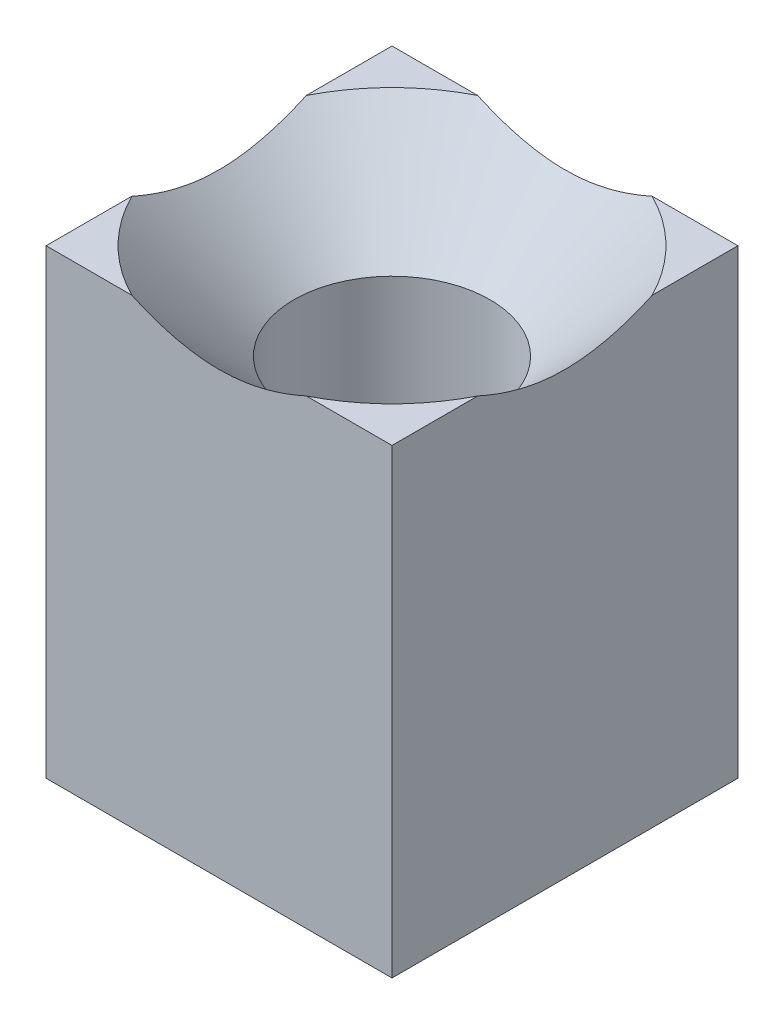
ISO-10303-21;
HEADER;
FILE_DESCRIPTION(('STEP AP214'),'2;1');
FILE_NAME('part.step','',(''),(''),'','','');
FILE_SCHEMA(('AUTOMOTIVE_DESIGN { 1 0 10303 214 1 1 1 1 }'));
ENDSEC;
DATA;
#1=APPLICATION_CONTEXT('core data for automotive mechanical design processes');
#2=APPLICATION_PROTOCOL_DEFINITION('international standard','automotive_design',2000,#1);
#3=PRODUCT_CONTEXT('',#1,'mechanical');
#4=PRODUCT('Part','Part','',(#3));
#5=PRODUCT_RELATED_PRODUCT_CATEGORY('part','',(#4));
#6=PRODUCT_DEFINITION_FORMATION('','',#4);
#7=PRODUCT_DEFINITION_CONTEXT('part definition',#1,'design');
#8=PRODUCT_DEFINITION('design','',#6,#7);
#9=PRODUCT_DEFINITION_SHAPE('','',#8);
#10=(LENGTH_UNIT() NAMED_UNIT(*) SI_UNIT(.MILLI.,.METRE.));
#11=(NAMED_UNIT(*) PLANE_ANGLE_UNIT() SI_UNIT($,.RADIAN.));
#12=(NAMED_UNIT(*) SI_UNIT($,.STERADIAN.) SOLID_ANGLE_UNIT());
#13=UNCERTAINTY_MEASURE_WITH_UNIT(LENGTH_MEASURE(1.E-05),#10,'distance_accuracy_value','');
#14=(GEOMETRIC_REPRESENTATION_CONTEXT(3) GLOBAL_UNCERTAINTY_ASSIGNED_CONTEXT((#13)) GLOBAL_UNIT_ASSIGNED_CONTEXT((#10,
#11,#12)) REPRESENTATION_CONTEXT('',''));
#15=CARTESIAN_POINT('',(0.,0.,0.));
#16=DIRECTION('',(0.,0.,1.));
#17=DIRECTION('',(1.,0.,0.));
#18=AXIS2_PLACEMENT_3D('',#15,#16,#17);
#19=CARTESIAN_POINT('',(0.,8.,0.));
#20=DIRECTION('',(0.,1.,0.));
#21=DIRECTION('',(0.,0.,1.));
#22=AXIS2_PLACEMENT_3D('',#19,#20,#21);
#23=PLANE('',#22);
#24=CARTESIAN_POINT('',(0.,8.,0.));
#25=DIRECTION('',(0.,1.,0.));
#26=DIRECTION('',(0.,0.,1.));
#27=AXIS2_PLACEMENT_3D('',#24,#25,#26);
#28=CIRCLE('',#27,3.36);
#29=CARTESIAN_POINT('',(1.51314242555022,8.,3.));
#30=VERTEX_POINT('',#29);
#31=CARTESIAN_POINT('',(3.,8.,1.51314242555022));
#32=VERTEX_POINT('',#31);
#33=EDGE_CURVE('E115',#30,#32,#28,.T.);
#34=ORIENTED_EDGE('',*,*,#33,.F.);
#35=DIRECTION('',(1.,0.,0.));
#36=VECTOR('',#35,1.);
#37=CARTESIAN_POINT('',(3.,8.,3.));
#38=LINE('',#37,#36);
#39=CARTESIAN_POINT('',(3.,8.,3.));
#40=VERTEX_POINT('',#39);
#41=EDGE_CURVE('E125',#30,#40,#38,.T.);
#42=ORIENTED_EDGE('',*,*,#41,.T.);
#43=DIRECTION('',(0.,0.,-1.));
#44=VECTOR('',#43,1.);
#45=CARTESIAN_POINT('',(3.,8.,3.));
#46=LINE('',#45,#44);
#47=EDGE_CURVE('E128',#40,#32,#46,.T.);
#48=ORIENTED_EDGE('',*,*,#47,.T.);
#49=EDGE_LOOP('',(#34,#42,#48));
#50=FACE_BOUND('',#49,.T.);
#51=ADVANCED_FACE('F35',(#50),#23,.T.);
#52=CARTESIAN_POINT('',(3.,8.,-1.51314242555022));
#53=VERTEX_POINT('',#52);
#54=CARTESIAN_POINT('',(1.51314242555022,8.,-3.));
#55=VERTEX_POINT('',#54);
#56=EDGE_CURVE('E52',#53,#55,#28,.T.);
#57=ORIENTED_EDGE('',*,*,#56,.F.);
#58=CARTESIAN_POINT('',(3.,8.,-3.));
#59=VERTEX_POINT('',#58);
#60=EDGE_CURVE('E136',#53,#59,#46,.T.);
#61=ORIENTED_EDGE('',*,*,#60,.T.);
#62=DIRECTION('',(-1.,0.,0.));
#63=VECTOR('',#62,1.);
#64=CARTESIAN_POINT('',(3.,8.,-3.));
#65=LINE('',#64,#63);
#66=EDGE_CURVE('E141',#59,#55,#65,.T.);
#67=ORIENTED_EDGE('',*,*,#66,.T.);
#68=EDGE_LOOP('',(#57,#61,#67));
#69=FACE_BOUND('',#68,.T.);
#70=ADVANCED_FACE('F205',(#69),#23,.T.);
#71=CARTESIAN_POINT('',(-1.51314242555022,8.,-3.));
#72=VERTEX_POINT('',#71);
#73=CARTESIAN_POINT('',(-3.,8.,-1.51314242555022));
#74=VERTEX_POINT('',#73);
#75=EDGE_CURVE('E218',#72,#74,#28,.T.);
#76=ORIENTED_EDGE('',*,*,#75,.F.);
#77=CARTESIAN_POINT('',(-3.,8.,-3.));
#78=VERTEX_POINT('',#77);
#79=EDGE_CURVE('E60',#72,#78,#65,.T.);
#80=ORIENTED_EDGE('',*,*,#79,.T.);
#81=DIRECTION('',(0.,0.,1.));
#82=VECTOR('',#81,1.);
#83=CARTESIAN_POINT('',(-3.,8.,3.));
#84=LINE('',#83,#82);
#85=EDGE_CURVE('E134',#78,#74,#84,.T.);
#86=ORIENTED_EDGE('',*,*,#85,.T.);
#87=EDGE_LOOP('',(#76,#80,#86));
#88=FACE_BOUND('',#87,.T.);
#89=ADVANCED_FACE('F210',(#88),#23,.T.);
#90=CARTESIAN_POINT('',(-3.,8.,1.51314242555022));
#91=VERTEX_POINT('',#90);
#92=CARTESIAN_POINT('',(-1.51314242555022,8.,3.));
#93=VERTEX_POINT('',#92);
#94=EDGE_CURVE('E117',#91,#93,#28,.T.);
#95=ORIENTED_EDGE('',*,*,#94,.F.);
#96=CARTESIAN_POINT('',(-3.,8.,3.));
#97=VERTEX_POINT('',#96);
#98=EDGE_CURVE('E90',#91,#97,#84,.T.);
#99=ORIENTED_EDGE('',*,*,#98,.T.);
#100=EDGE_CURVE('E133',#97,#93,#38,.T.);
#101=ORIENTED_EDGE('',*,*,#100,.T.);
#102=EDGE_LOOP('',(#95,#99,#101));
#103=FACE_BOUND('',#102,.T.);
#104=ADVANCED_FACE('F206',(#103),#23,.T.);
#105=CARTESIAN_POINT('',(0.,0.,0.));
#106=DIRECTION('',(0.,1.,0.));
#107=DIRECTION('',(0.,0.,1.));
#108=AXIS2_PLACEMENT_3D('',#105,#106,#107);
#109=PLANE('',#108);
#110=CARTESIAN_POINT('',(0.,0.,0.));
#111=DIRECTION('',(0.,1.,0.));
#112=DIRECTION('',(0.,0.,1.));
#113=AXIS2_PLACEMENT_3D('',#110,#111,#112);
#114=CIRCLE('',#113,1.7);
#115=CARTESIAN_POINT('',(0.,0.,1.7));
#116=VERTEX_POINT('',#115);
#117=EDGE_CURVE('E40',#116,#116,#114,.T.);
#118=ORIENTED_EDGE('',*,*,#117,.T.);
#119=EDGE_LOOP('',(#118));
#120=FACE_BOUND('',#119,.T.);
#121=DIRECTION('',(0.,0.,1.));
#122=VECTOR('',#121,1.);
#123=CARTESIAN_POINT('',(-3.,0.,3.));
#124=LINE('',#123,#122);
#125=CARTESIAN_POINT('',(-3.,0.,-3.));
#126=VERTEX_POINT('',#125);
#127=CARTESIAN_POINT('',(-3.,0.,3.));
#128=VERTEX_POINT('',#127);
#129=EDGE_CURVE('E145',#126,#128,#124,.T.);
#130=ORIENTED_EDGE('',*,*,#129,.F.);
#131=DIRECTION('',(-1.,0.,0.));
#132=VECTOR('',#131,1.);
#133=CARTESIAN_POINT('',(3.,0.,-3.));
#134=LINE('',#133,#132);
#135=CARTESIAN_POINT('',(3.,0.,-3.));
#136=VERTEX_POINT('',#135);
#137=EDGE_CURVE('E82',#136,#126,#134,.T.);
#138=ORIENTED_EDGE('',*,*,#137,.F.);
#139=DIRECTION('',(0.,0.,-1.));
#140=VECTOR('',#139,1.);
#141=CARTESIAN_POINT('',(3.,0.,3.));
#142=LINE('',#141,#140);
#143=CARTESIAN_POINT('',(3.,0.,3.));
#144=VERTEX_POINT('',#143);
#145=EDGE_CURVE('E150',#144,#136,#142,.T.);
#146=ORIENTED_EDGE('',*,*,#145,.F.);
#147=DIRECTION('',(1.,0.,0.));
#148=VECTOR('',#147,1.);
#149=CARTESIAN_POINT('',(3.,0.,3.));
#150=LINE('',#149,#148);
#151=EDGE_CURVE('E148',#128,#144,#150,.T.);
#152=ORIENTED_EDGE('',*,*,#151,.F.);
#153=EDGE_LOOP('',(#130,#138,#146,#152));
#154=FACE_BOUND('',#153,.T.);
#155=ADVANCED_FACE('F202',(#120,#154),#109,.F.);
#156=CARTESIAN_POINT('',(-3.,8.,3.));
#157=DIRECTION('',(1.,0.,0.));
#158=DIRECTION('',(0.,0.,-1.));
#159=AXIS2_PLACEMENT_3D('',#156,#157,#158);
#160=PLANE('',#159);
#161=ORIENTED_EDGE('',*,*,#98,.F.);
#162=CARTESIAN_POINT('',(-3.,10.685717905521,-5.2488765458084));
#163=CARTESIAN_POINT('',(-3.,10.5761926870492,-5.12269941055242));
#164=CARTESIAN_POINT('',(-3.,10.4671958831031,-4.99605810231777));
#165=CARTESIAN_POINT('',(-3.,10.2505455199257,-4.74159707934349));
#166=CARTESIAN_POINT('',(-3.,10.1428921817638,-4.61377717652789));
#167=CARTESIAN_POINT('',(-3.,9.92850442866118,-4.35585162740521));
#168=CARTESIAN_POINT('',(-3.,9.82178169333089,-4.22573624978875));
#169=CARTESIAN_POINT('',(-3.,9.61047693063371,-3.96379091417701));
#170=CARTESIAN_POINT('',(-3.,9.50589474485612,-3.83196108424869));
#171=CARTESIAN_POINT('',(-3.,9.29089788868376,-3.55514879722237));
#172=CARTESIAN_POINT('',(-3.,9.18071904390069,-3.40998243523561));
#173=CARTESIAN_POINT('',(-3.,8.96461814632388,-3.1164410496452));
#174=CARTESIAN_POINT('',(-3.,8.85869713058463,-2.96806525771325));
#175=CARTESIAN_POINT('',(-3.,8.65306120433006,-2.66769958051829));
#176=CARTESIAN_POINT('',(-3.,8.55332866269904,-2.51572184550591));
#177=CARTESIAN_POINT('',(-3.,8.36217506680553,-2.20666284849887));
#178=CARTESIAN_POINT('',(-3.,8.27074899295309,-2.04958474761364));
#179=CARTESIAN_POINT('',(-3.,8.12872366147334,-1.78304138774352));
#180=CARTESIAN_POINT('',(-3.,8.07475340827989,-1.67538233294628));
#181=CARTESIAN_POINT('',(-3.,7.97361507227203,-1.45683923147125));
#182=CARTESIAN_POINT('',(-3.,7.92644875001231,-1.34595435898262));
#183=CARTESIAN_POINT('',(-3.,7.84141756766864,-1.12232672773142));
#184=CARTESIAN_POINT('',(-3.,7.80343656746545,-1.00962875693416));
#185=CARTESIAN_POINT('',(-3.,7.73811182404611,-0.781177848295501));
#186=CARTESIAN_POINT('',(-3.,7.71076242220193,-0.665426570695889));
#187=CARTESIAN_POINT('',(-3.,7.67380968662833,-0.45999475059348));
#188=CARTESIAN_POINT('',(-3.,7.66151125717146,-0.370798886117144));
#189=CARTESIAN_POINT('',(-3.,7.64479563284063,-0.191673101057394));
#190=CARTESIAN_POINT('',(-3.,7.64037688385227,-0.101743328738836));
#191=CARTESIAN_POINT('',(-3.,7.63966956796859,0.0781334670692069));
#192=CARTESIAN_POINT('',(-3.,7.64337963266014,0.168080485106732));
#193=CARTESIAN_POINT('',(-3.,7.65871443695603,0.347299944117987));
#194=CARTESIAN_POINT('',(-3.,7.67034073599648,0.436572248674365));
#195=CARTESIAN_POINT('',(-3.,7.70529502594965,0.639251752591134));
#196=CARTESIAN_POINT('',(-3.,7.73102139392333,0.752245095939798));
#197=CARTESIAN_POINT('',(-3.,7.79274900887921,0.975374327850341));
#198=CARTESIAN_POINT('',(-3.,7.8287550187114,1.08550886598202));
#199=CARTESIAN_POINT('',(-3.,7.90963001948522,1.30420649872426));
#200=CARTESIAN_POINT('',(-3.,7.95461742986205,1.41272517591908));
#201=CARTESIAN_POINT('',(-3.,8.05129264945445,1.62666068199334));
#202=CARTESIAN_POINT('',(-3.,8.10297856522043,1.73207837712671));
#203=CARTESIAN_POINT('',(-3.,8.20683301131955,1.9310229843335));
#204=CARTESIAN_POINT('',(-3.,8.2585615144255,2.02478180210751));
#205=CARTESIAN_POINT('',(-3.,8.36553439142128,2.21027955174288));
#206=CARTESIAN_POINT('',(-3.,8.4207793150772,2.3020181647277));
#207=CARTESIAN_POINT('',(-3.,8.59081127146672,2.57472825624921));
#208=CARTESIAN_POINT('',(-3.,8.70982366582286,2.75306114666383));
#209=CARTESIAN_POINT('',(-3.,8.95581824422235,3.10518004453106));
#210=CARTESIAN_POINT('',(-3.,9.08283205357709,3.27894359073622));
#211=CARTESIAN_POINT('',(-3.,9.34205295904158,3.62242742572967));
#212=CARTESIAN_POINT('',(-3.,9.47425798905952,3.79214928074918));
#213=CARTESIAN_POINT('',(-3.,9.72975965044763,4.11267355044361));
#214=CARTESIAN_POINT('',(-3.,9.85271710849406,4.26374787195858));
#215=CARTESIAN_POINT('',(-3.,10.1010067353303,4.56395741857012));
#216=CARTESIAN_POINT('',(-3.,10.2263391706353,4.71309242283586));
#217=CARTESIAN_POINT('',(-3.,10.4776642164854,5.00842256345542));
#218=CARTESIAN_POINT('',(-3.,10.6036399036846,5.15463213871626));
#219=CARTESIAN_POINT('',(-3.,10.8570150287552,5.44576194068198));
#220=CARTESIAN_POINT('',(-3.,10.9844141766185,5.59068241959095));
#221=CARTESIAN_POINT('',(-3.,11.1123632181624,5.73510990547016));
#222=B_SPLINE_CURVE_WITH_KNOTS('',3,(#162,#163,#164,#165,#166,#167,#168,#169,#170,#171,#172,
#173,#174,#175,#176,#177,#178,#179,#180,#181,#182,#183,#184,#185,#186,#187,#188,#189,#190,#191,
#192,#193,#194,#195,#196,#197,#198,#199,#200,#201,#202,#203,#204,#205,#206,#207,#208,#209,#210,
#211,#212,#213,#214,#215,#216,#217,#218,#219,#220,#221),.UNSPECIFIED.,.F.,.F.,(4,2,2,2,2,2,2,2,
2,2,2,2,2,2,2,2,2,2,2,2,2,2,2,2,2,2,2,2,2,4),(0.,0.501251133193811,1.00258368840899,
1.50741981032327,2.0122184359198,2.55889147945074,3.10569687598749,3.65086518461985,
4.19570182636092,4.55681141376252,4.91801427329926,5.27437837568711,5.63055254407822,
5.9003552736087,6.17010478388626,6.43980888773347,6.7095661365521,7.05661714078059,
7.40382920528015,7.75596394775607,8.10799936941069,8.42915499675328,8.75036095829726,
9.39322501280749,10.0388123137442,10.6841452264875,11.2684784073307,11.8528775538182,
12.4318527931201,13.0107121514098),.UNSPECIFIED.);
#223=EDGE_CURVE('E120',#91,#74,#222,.F.);
#224=ORIENTED_EDGE('',*,*,#223,.T.);
#225=ORIENTED_EDGE('',*,*,#85,.F.);
#226=DIRECTION('',(0.,-1.,0.));
#227=VECTOR('',#226,1.);
#228=CARTESIAN_POINT('',(-3.,8.,-3.));
#229=LINE('',#228,#227);
#230=EDGE_CURVE('E144',#78,#126,#229,.T.);
#231=ORIENTED_EDGE('',*,*,#230,.T.);
#232=ORIENTED_EDGE('',*,*,#129,.T.);
#233=DIRECTION('',(0.,-1.,0.));
#234=VECTOR('',#233,1.);
#235=CARTESIAN_POINT('',(-3.,8.,3.));
#236=LINE('',#235,#234);
#237=EDGE_CURVE('E45',#97,#128,#236,.T.);
#238=ORIENTED_EDGE('',*,*,#237,.F.);
#239=EDGE_LOOP('',(#161,#224,#225,#231,#232,#238));
#240=FACE_BOUND('',#239,.T.);
#241=ADVANCED_FACE('F37',(#240),#160,.F.);
#242=CARTESIAN_POINT('',(3.,8.,3.));
#243=DIRECTION('',(0.,0.,-1.));
#244=DIRECTION('',(-1.,0.,0.));
#245=AXIS2_PLACEMENT_3D('',#242,#243,#244);
#246=PLANE('',#245);
#247=ORIENTED_EDGE('',*,*,#41,.F.);
#248=CARTESIAN_POINT('',(-5.24887715652433,10.685718435743,3.));
#249=CARTESIAN_POINT('',(-5.12270000145323,10.5761931969342,3.));
#250=CARTESIAN_POINT('',(-4.99605867338169,10.4671963726608,3.));
#251=CARTESIAN_POINT('',(-4.74159761064497,10.2505459688796,3.));
#252=CARTESIAN_POINT('',(-4.61377768790381,10.1428926104412,3.));
#253=CARTESIAN_POINT('',(-4.35585209848053,9.92850481658087,3.));
#254=CARTESIAN_POINT('',(-4.22573670048613,9.82178206077249,3.));
#255=CARTESIAN_POINT('',(-3.96379132392594,9.61047725728873,3.));
#256=CARTESIAN_POINT('',(-3.83196147342716,9.50589505120259,3.));
#257=CARTESIAN_POINT('',(-3.55514914045877,9.29089815084935,3.));
#258=CARTESIAN_POINT('',(-3.4099827530264,9.18071928227949,3.));
#259=CARTESIAN_POINT('',(-3.11644131583787,8.96461833785804,3.));
#260=CARTESIAN_POINT('',(-2.96806549775293,8.85869729906155,3.));
#261=CARTESIAN_POINT('',(-2.66769976739014,8.65306132813249,3.));
#262=CARTESIAN_POINT('',(-2.51572200536918,8.55332876487586,3.));
#263=CARTESIAN_POINT('',(-2.20666295278159,8.36217512799698,3.));
#264=CARTESIAN_POINT('',(-2.04958482332657,8.27074903478155,3.));
#265=CARTESIAN_POINT('',(-1.78304143064867,8.12872368335441,3.));
#266=CARTESIAN_POINT('',(-1.67538237270064,8.0747534276047,3.));
#267=CARTESIAN_POINT('',(-1.45683926473668,7.97361508673884,3.));
#268=CARTESIAN_POINT('',(-1.34595438890972,7.92644876217778,3.));
#269=CARTESIAN_POINT('',(-1.12232675096026,7.84141757572608,3.));
#270=CARTESIAN_POINT('',(-1.00962877681051,7.80343657369909,3.));
#271=CARTESIAN_POINT('',(-0.781177861252196,7.73811182720275,3.));
#272=CARTESIAN_POINT('',(-0.665426580085742,7.71076242410435,3.));
#273=CARTESIAN_POINT('',(-0.459994756534912,7.67380968753528,3.));
#274=CARTESIAN_POINT('',(-0.370798892254225,7.66151125793057,3.));
#275=CARTESIAN_POINT('',(-0.191673107573671,7.64479563326254,3.));
#276=CARTESIAN_POINT('',(-0.10174333543867,7.64037688408472,3.));
#277=CARTESIAN_POINT('',(0.0781334600185568,7.63966956779025,3.));
#278=CARTESIAN_POINT('',(0.16808047788882,7.64337963226025,3.));
#279=CARTESIAN_POINT('',(0.347299936587002,7.65871443609368,3.));
#280=CARTESIAN_POINT('',(0.436572240997572,7.67034073489324,3.));
#281=CARTESIAN_POINT('',(0.639251744319007,7.70529502423931,3.));
#282=CARTESIAN_POINT('',(0.752245087229741,7.73102139181449,3.));
#283=CARTESIAN_POINT('',(0.975374318302544,7.7927490059362,3.));
#284=CARTESIAN_POINT('',(1.08550885603445,7.82875501533264,3.));
#285=CARTESIAN_POINT('',(1.30420648801048,7.90963001521892,3.));
#286=CARTESIAN_POINT('',(1.41272516483897,7.95461742514457,3.));
#287=CARTESIAN_POINT('',(1.62666067019922,8.05129264383525,3.));
#288=CARTESIAN_POINT('',(1.73207836498489,8.10297855915071,3.));
#289=CARTESIAN_POINT('',(1.93102297088779,8.20683300405549,3.));
#290=CARTESIAN_POINT('',(2.02478178772048,8.25856150638727,3.));
#291=CARTESIAN_POINT('',(2.21027953550369,8.36553438179854,3.));
#292=CARTESIAN_POINT('',(2.3020181475777,8.4207793046441,3.));
#293=CARTESIAN_POINT('',(2.57472823639853,8.5908112585662,3.));
#294=CARTESIAN_POINT('',(2.75306112505731,8.70982365123055,3.));
#295=CARTESIAN_POINT('',(3.10518001945389,8.95581822620127,3.));
#296=CARTESIAN_POINT('',(3.27894356394445,9.08283203381887,3.));
#297=CARTESIAN_POINT('',(3.62242739553588,9.34205293579451,3.));
#298=CARTESIAN_POINT('',(3.79214924886794,9.47425796406076,3.));
#299=CARTESIAN_POINT('',(4.11267351542502,9.72975962215847,3.));
#300=CARTESIAN_POINT('',(4.26374783548784,9.85271707866795,3.));
#301=CARTESIAN_POINT('',(4.56395737919894,10.1010067024313,3.));
#302=CARTESIAN_POINT('',(4.7130923820164,10.2263391362004,3.));
#303=CARTESIAN_POINT('',(5.00842251975177,10.4776641789935,3.));
#304=CARTESIAN_POINT('',(5.15463209357672,10.6036398646714,3.));
#305=CARTESIAN_POINT('',(5.44576189267101,10.8570149867028,3.));
#306=CARTESIAN_POINT('',(5.59068237014442,10.9844141330481,3.));
#307=CARTESIAN_POINT('',(5.73510985458746,11.1123631730757,3.));
#308=B_SPLINE_CURVE_WITH_KNOTS('',3,(#248,#249,#250,#251,#252,#253,#254,#255,#256,#257,#258,
#259,#260,#261,#262,#263,#264,#265,#266,#267,#268,#269,#270,#271,#272,#273,#274,#275,#276,#277,
#278,#279,#280,#281,#282,#283,#284,#285,#286,#287,#288,#289,#290,#291,#292,#293,#294,#295,#296,
#297,#298,#299,#300,#301,#302,#303,#304,#305,#306,#307),.UNSPECIFIED.,.F.,.F.,(4,2,2,2,2,2,2,2,
2,2,2,2,2,2,2,2,2,2,2,2,2,2,2,2,2,2,2,2,2,4),(0.,0.5012512180798,1.00258385820255,
1.50742006634512,2.01221877815168,2.55889192562366,3.10569742618142,3.65086583810472,
4.19570258294857,4.55681218223126,4.91801505366879,5.27437916730747,5.63055334691918,
5.90035607593306,6.17010558569078,6.43980968901105,6.70956693730314,7.05661793998928,
7.40383000294341,7.75596474388547,8.10800016400771,8.4291557877572,8.7503617457068,
9.39322579302009,10.0388130867284,10.6841459922484,11.268479166802,11.8528783069985,
12.431853540058,13.0107128921063),.UNSPECIFIED.);
#309=EDGE_CURVE('E112',#30,#93,#308,.F.);
#310=ORIENTED_EDGE('',*,*,#309,.T.);
#311=ORIENTED_EDGE('',*,*,#100,.F.);
#312=ORIENTED_EDGE('',*,*,#237,.T.);
#313=ORIENTED_EDGE('',*,*,#151,.T.);
#314=DIRECTION('',(0.,-1.,0.));
#315=VECTOR('',#314,1.);
#316=CARTESIAN_POINT('',(3.,8.,3.));
#317=LINE('',#316,#315);
#318=EDGE_CURVE('E132',#40,#144,#317,.T.);
#319=ORIENTED_EDGE('',*,*,#318,.F.);
#320=EDGE_LOOP('',(#247,#310,#311,#312,#313,#319));
#321=FACE_BOUND('',#320,.T.);
#322=ADVANCED_FACE('F130',(#321),#246,.F.);
#323=CARTESIAN_POINT('',(3.,8.,3.));
#324=DIRECTION('',(-1.,0.,0.));
#325=DIRECTION('',(0.,0.,1.));
#326=AXIS2_PLACEMENT_3D('',#323,#324,#325);
#327=PLANE('',#326);
#328=ORIENTED_EDGE('',*,*,#60,.F.);
#329=CARTESIAN_POINT('',(3.,10.685717905521,-5.2488765458084));
#330=CARTESIAN_POINT('',(3.,10.5761926870492,-5.12269941055241));
#331=CARTESIAN_POINT('',(3.,10.4671958831031,-4.99605810231777));
#332=CARTESIAN_POINT('',(3.,10.2505455199257,-4.74159707934349));
#333=CARTESIAN_POINT('',(3.,10.1428921817638,-4.61377717652789));
#334=CARTESIAN_POINT('',(3.,9.92850442866118,-4.35585162740521));
#335=CARTESIAN_POINT('',(3.,9.82178169333089,-4.22573624978875));
#336=CARTESIAN_POINT('',(3.,9.61047693063371,-3.96379091417701));
#337=CARTESIAN_POINT('',(3.,9.50589474485612,-3.83196108424868));
#338=CARTESIAN_POINT('',(3.,9.29089788868376,-3.55514879722237));
#339=CARTESIAN_POINT('',(3.,9.18071904390069,-3.40998243523561));
#340=CARTESIAN_POINT('',(3.,8.96461814632388,-3.1164410496452));
#341=CARTESIAN_POINT('',(3.,8.85869713058463,-2.96806525771325));
#342=CARTESIAN_POINT('',(3.,8.65306120433006,-2.66769958051829));
#343=CARTESIAN_POINT('',(3.,8.55332866269904,-2.51572184550591));
#344=CARTESIAN_POINT('',(3.,8.36217506680553,-2.20666284849887));
#345=CARTESIAN_POINT('',(3.,8.2707489929531,-2.04958474761364));
#346=CARTESIAN_POINT('',(3.,8.12872366147334,-1.78304138774352));
#347=CARTESIAN_POINT('',(3.,8.07475340827989,-1.67538233294628));
#348=CARTESIAN_POINT('',(3.,7.97361507227203,-1.45683923147125));
#349=CARTESIAN_POINT('',(3.,7.92644875001231,-1.34595435898262));
#350=CARTESIAN_POINT('',(3.,7.84141756766864,-1.12232672773142));
#351=CARTESIAN_POINT('',(3.,7.80343656746545,-1.00962875693416));
#352=CARTESIAN_POINT('',(3.,7.73811182404611,-0.781177848295502));
#353=CARTESIAN_POINT('',(3.,7.71076242220193,-0.66542657069589));
#354=CARTESIAN_POINT('',(3.,7.67380968662833,-0.459994750593481));
#355=CARTESIAN_POINT('',(3.,7.66151125717146,-0.370798886117145));
#356=CARTESIAN_POINT('',(3.,7.64479563284063,-0.191673101057395));
#357=CARTESIAN_POINT('',(3.,7.64037688385227,-0.101743328738837));
#358=CARTESIAN_POINT('',(3.,7.63966956796859,0.0781334670692064));
#359=CARTESIAN_POINT('',(3.,7.64337963266014,0.168080485106732));
#360=CARTESIAN_POINT('',(3.,7.65871443695603,0.347299944117986));
#361=CARTESIAN_POINT('',(3.,7.67034073599648,0.436572248674365));
#362=CARTESIAN_POINT('',(3.,7.70529502594965,0.639251752591133));
#363=CARTESIAN_POINT('',(3.,7.73102139392333,0.752245095939797));
#364=CARTESIAN_POINT('',(3.,7.79274900887921,0.975374327850341));
#365=CARTESIAN_POINT('',(3.,7.8287550187114,1.08550886598202));
#366=CARTESIAN_POINT('',(3.,7.90963001948522,1.30420649872426));
#367=CARTESIAN_POINT('',(3.,7.95461742986205,1.41272517591908));
#368=CARTESIAN_POINT('',(3.,8.05129264945445,1.62666068199334));
#369=CARTESIAN_POINT('',(3.,8.10297856522043,1.73207837712671));
#370=CARTESIAN_POINT('',(3.,8.20683301131955,1.9310229843335));
#371=CARTESIAN_POINT('',(3.,8.2585615144255,2.02478180210751));
#372=CARTESIAN_POINT('',(3.,8.36553439142128,2.21027955174287));
#373=CARTESIAN_POINT('',(3.,8.4207793150772,2.3020181647277));
#374=CARTESIAN_POINT('',(3.,8.59081127146672,2.57472825624921));
#375=CARTESIAN_POINT('',(3.,8.70982366582286,2.75306114666382));
#376=CARTESIAN_POINT('',(3.,8.95581824422235,3.10518004453106));
#377=CARTESIAN_POINT('',(3.,9.08283205357709,3.27894359073621));
#378=CARTESIAN_POINT('',(3.,9.34205295904158,3.62242742572967));
#379=CARTESIAN_POINT('',(3.,9.47425798905952,3.79214928074917));
#380=CARTESIAN_POINT('',(3.,9.72975965044763,4.1126735504436));
#381=CARTESIAN_POINT('',(3.,9.85271710849405,4.26374787195857));
#382=CARTESIAN_POINT('',(3.,10.1010067353303,4.56395741857011));
#383=CARTESIAN_POINT('',(3.,10.2263391706353,4.71309242283586));
#384=CARTESIAN_POINT('',(3.,10.4776642164854,5.00842256345541));
#385=CARTESIAN_POINT('',(3.,10.6036399036846,5.15463213871625));
#386=CARTESIAN_POINT('',(3.,10.8570150287552,5.44576194068197));
#387=CARTESIAN_POINT('',(3.,10.9844141766185,5.59068241959094));
#388=CARTESIAN_POINT('',(3.,11.1123632181624,5.73510990547015));
#389=B_SPLINE_CURVE_WITH_KNOTS('',3,(#329,#330,#331,#332,#333,#334,#335,#336,#337,#338,#339,
#340,#341,#342,#343,#344,#345,#346,#347,#348,#349,#350,#351,#352,#353,#354,#355,#356,#357,#358,
#359,#360,#361,#362,#363,#364,#365,#366,#367,#368,#369,#370,#371,#372,#373,#374,#375,#376,#377,
#378,#379,#380,#381,#382,#383,#384,#385,#386,#387,#388),.UNSPECIFIED.,.F.,.F.,(4,2,2,2,2,2,2,2,
2,2,2,2,2,2,2,2,2,2,2,2,2,2,2,2,2,2,2,2,2,4),(0.,0.50125113319381,1.00258368840899,
1.50741981032327,2.0122184359198,2.55889147945074,3.10569687598748,3.65086518461985,
4.19570182636092,4.55681141376251,4.91801427329926,5.27437837568711,5.63055254407822,
5.90035527360869,6.17010478388626,6.43980888773347,6.7095661365521,7.05661714078058,
7.40382920528015,7.75596394775607,8.10799936941069,8.42915499675328,8.75036095829726,
9.39322501280748,10.0388123137442,10.6841452264875,11.2684784073307,11.8528775538182,
12.4318527931201,13.0107121514098),.UNSPECIFIED.);
#390=EDGE_CURVE('E188',#53,#32,#389,.T.);
#391=ORIENTED_EDGE('',*,*,#390,.T.);
#392=ORIENTED_EDGE('',*,*,#47,.F.);
#393=ORIENTED_EDGE('',*,*,#318,.T.);
#394=ORIENTED_EDGE('',*,*,#145,.T.);
#395=DIRECTION('',(0.,-1.,0.));
#396=VECTOR('',#395,1.);
#397=CARTESIAN_POINT('',(3.,8.,-3.));
#398=LINE('',#397,#396);
#399=EDGE_CURVE('E154',#59,#136,#398,.T.);
#400=ORIENTED_EDGE('',*,*,#399,.F.);
#401=EDGE_LOOP('',(#328,#391,#392,#393,#394,#400));
#402=FACE_BOUND('',#401,.T.);
#403=ADVANCED_FACE('F193',(#402),#327,.F.);
#404=CARTESIAN_POINT('',(3.,8.,-3.));
#405=DIRECTION('',(0.,0.,1.));
#406=DIRECTION('',(1.,0.,0.));
#407=AXIS2_PLACEMENT_3D('',#404,#405,#406);
#408=PLANE('',#407);
#409=ORIENTED_EDGE('',*,*,#79,.F.);
#410=CARTESIAN_POINT('',(-5.2488765458084,10.685717905521,-3.));
#411=CARTESIAN_POINT('',(-5.12269941055242,10.5761926870492,-3.));
#412=CARTESIAN_POINT('',(-4.99605810231777,10.4671958831031,-3.));
#413=CARTESIAN_POINT('',(-4.74159707934349,10.2505455199257,-3.));
#414=CARTESIAN_POINT('',(-4.61377717652789,10.1428921817638,-3.));
#415=CARTESIAN_POINT('',(-4.35585162740521,9.92850442866118,-3.));
#416=CARTESIAN_POINT('',(-4.22573624978875,9.82178169333089,-3.));
#417=CARTESIAN_POINT('',(-3.96379091417701,9.6104769306337,-3.));
#418=CARTESIAN_POINT('',(-3.83196108424868,9.50589474485611,-3.));
#419=CARTESIAN_POINT('',(-3.55514879722237,9.29089788868375,-3.));
#420=CARTESIAN_POINT('',(-3.4099824352356,9.18071904390069,-3.));
#421=CARTESIAN_POINT('',(-3.11644104964519,8.96461814632388,-3.));
#422=CARTESIAN_POINT('',(-2.96806525771325,8.85869713058463,-3.));
#423=CARTESIAN_POINT('',(-2.66769958051828,8.65306120433006,-3.));
#424=CARTESIAN_POINT('',(-2.5157218455059,8.55332866269904,-3.));
#425=CARTESIAN_POINT('',(-2.20666284849887,8.36217506680552,-3.));
#426=CARTESIAN_POINT('',(-2.04958474761364,8.27074899295309,-3.));
#427=CARTESIAN_POINT('',(-1.78304138774352,8.12872366147334,-3.));
#428=CARTESIAN_POINT('',(-1.67538233294628,8.07475340827989,-3.));
#429=CARTESIAN_POINT('',(-1.45683923147125,7.97361507227202,-3.));
#430=CARTESIAN_POINT('',(-1.34595435898262,7.92644875001231,-3.));
#431=CARTESIAN_POINT('',(-1.12232672773142,7.84141756766864,-3.));
#432=CARTESIAN_POINT('',(-1.00962875693416,7.80343656746545,-3.));
#433=CARTESIAN_POINT('',(-0.7811778482955,7.73811182404611,-3.));
#434=CARTESIAN_POINT('',(-0.665426570695889,7.71076242220193,-3.));
#435=CARTESIAN_POINT('',(-0.459994750593481,7.67380968662833,-3.));
#436=CARTESIAN_POINT('',(-0.370798886117145,7.66151125717146,-3.));
#437=CARTESIAN_POINT('',(-0.191673101057395,7.64479563284063,-3.));
#438=CARTESIAN_POINT('',(-0.101743328738837,7.64037688385227,-3.));
#439=CARTESIAN_POINT('',(0.0781334670692064,7.63966956796859,-3.));
#440=CARTESIAN_POINT('',(0.168080485106731,7.64337963266014,-3.));
#441=CARTESIAN_POINT('',(0.347299944117986,7.65871443695603,-3.));
#442=CARTESIAN_POINT('',(0.436572248674365,7.67034073599648,-3.));
#443=CARTESIAN_POINT('',(0.639251752591133,7.70529502594965,-3.));
#444=CARTESIAN_POINT('',(0.752245095939797,7.73102139392333,-3.));
#445=CARTESIAN_POINT('',(0.975374327850341,7.79274900887921,-3.));
#446=CARTESIAN_POINT('',(1.08550886598202,7.8287550187114,-3.));
#447=CARTESIAN_POINT('',(1.30420649872426,7.90963001948522,-3.));
#448=CARTESIAN_POINT('',(1.41272517591908,7.95461742986205,-3.));
#449=CARTESIAN_POINT('',(1.62666068199334,8.05129264945445,-3.));
#450=CARTESIAN_POINT('',(1.73207837712671,8.10297856522043,-3.));
#451=CARTESIAN_POINT('',(1.9310229843335,8.20683301131955,-3.));
#452=CARTESIAN_POINT('',(2.02478180210751,8.2585615144255,-3.));
#453=CARTESIAN_POINT('',(2.21027955174287,8.36553439142128,-3.));
#454=CARTESIAN_POINT('',(2.3020181647277,8.4207793150772,-3.));
#455=CARTESIAN_POINT('',(2.57472825624921,8.59081127146672,-3.));
#456=CARTESIAN_POINT('',(2.75306114666383,8.70982366582286,-3.));
#457=CARTESIAN_POINT('',(3.10518004453106,8.95581824422235,-3.));
#458=CARTESIAN_POINT('',(3.27894359073622,9.08283205357709,-3.));
#459=CARTESIAN_POINT('',(3.62242742572967,9.34205295904158,-3.));
#460=CARTESIAN_POINT('',(3.79214928074917,9.47425798905952,-3.));
#461=CARTESIAN_POINT('',(4.1126735504436,9.72975965044763,-3.));
#462=CARTESIAN_POINT('',(4.26374787195857,9.85271710849406,-3.));
#463=CARTESIAN_POINT('',(4.56395741857012,10.1010067353303,-3.));
#464=CARTESIAN_POINT('',(4.71309242283586,10.2263391706353,-3.));
#465=CARTESIAN_POINT('',(5.00842256345542,10.4776642164854,-3.));
#466=CARTESIAN_POINT('',(5.15463213871625,10.6036399036846,-3.));
#467=CARTESIAN_POINT('',(5.44576194068198,10.8570150287552,-3.));
#468=CARTESIAN_POINT('',(5.59068241959094,10.9844141766185,-3.));
#469=CARTESIAN_POINT('',(5.73510990547016,11.1123632181624,-3.));
#470=B_SPLINE_CURVE_WITH_KNOTS('',3,(#410,#411,#412,#413,#414,#415,#416,#417,#418,#419,#420,
#421,#422,#423,#424,#425,#426,#427,#428,#429,#430,#431,#432,#433,#434,#435,#436,#437,#438,#439,
#440,#441,#442,#443,#444,#445,#446,#447,#448,#449,#450,#451,#452,#453,#454,#455,#456,#457,#458,
#459,#460,#461,#462,#463,#464,#465,#466,#467,#468,#469),.UNSPECIFIED.,.F.,.F.,(4,2,2,2,2,2,2,2,
2,2,2,2,2,2,2,2,2,2,2,2,2,2,2,2,2,2,2,2,2,4),(0.,0.501251133193811,1.00258368840899,
1.50741981032327,2.0122184359198,2.55889147945074,3.10569687598749,3.65086518461986,
4.19570182636092,4.55681141376252,4.91801427329926,5.27437837568712,5.63055254407823,
5.9003552736087,6.17010478388626,6.43980888773347,6.7095661365521,7.05661714078059,
7.40382920528015,7.75596394775607,8.10799936941069,8.42915499675328,8.75036095829726,
9.39322501280749,10.0388123137442,10.6841452264875,11.2684784073307,11.8528775538182,
12.4318527931201,13.0107121514098),.UNSPECIFIED.);
#471=EDGE_CURVE('E11',#72,#55,#470,.T.);
#472=ORIENTED_EDGE('',*,*,#471,.T.);
#473=ORIENTED_EDGE('',*,*,#66,.F.);
#474=ORIENTED_EDGE('',*,*,#399,.T.);
#475=ORIENTED_EDGE('',*,*,#137,.T.);
#476=ORIENTED_EDGE('',*,*,#230,.F.);
#477=EDGE_LOOP('',(#409,#472,#473,#474,#475,#476));
#478=FACE_BOUND('',#477,.T.);
#479=ADVANCED_FACE('F164',(#478),#408,.F.);
#480=CARTESIAN_POINT('',(0.,8.,0.));
#481=DIRECTION('',(0.,1.,0.));
#482=DIRECTION('',(0.,0.,1.));
#483=AXIS2_PLACEMENT_3D('',#480,#481,#482);
#484=CYLINDRICAL_SURFACE('',#483,1.7);
#485=CARTESIAN_POINT('',(0.,6.34,0.));
#486=DIRECTION('',(0.,1.,0.));
#487=DIRECTION('',(0.,0.,1.));
#488=AXIS2_PLACEMENT_3D('',#485,#486,#487);
#489=CIRCLE('',#488,1.7);
#490=CARTESIAN_POINT('',(0.,6.34,1.7));
#491=VERTEX_POINT('',#490);
#492=EDGE_CURVE('E121',#491,#491,#489,.T.);
#493=ORIENTED_EDGE('',*,*,#492,.T.);
#494=EDGE_LOOP('',(#493));
#495=FACE_BOUND('',#494,.T.);
#496=ORIENTED_EDGE('',*,*,#117,.F.);
#497=EDGE_LOOP('',(#496));
#498=FACE_BOUND('',#497,.T.);
#499=ADVANCED_FACE('F171',(#495,#498),#484,.F.);
#500=CARTESIAN_POINT('',(0.,8.,0.));
#501=DIRECTION('',(0.,1.,0.));
#502=DIRECTION('',(0.,0.,1.));
#503=AXIS2_PLACEMENT_3D('',#500,#501,#502);
#504=CONICAL_SURFACE('',#503,3.36,0.785398163397449);
#505=ORIENTED_EDGE('',*,*,#492,.F.);
#506=EDGE_LOOP('',(#505));
#507=FACE_BOUND('',#506,.T.);
#508=ORIENTED_EDGE('',*,*,#56,.T.);
#509=ORIENTED_EDGE('',*,*,#471,.F.);
#510=ORIENTED_EDGE('',*,*,#75,.T.);
#511=ORIENTED_EDGE('',*,*,#223,.F.);
#512=ORIENTED_EDGE('',*,*,#94,.T.);
#513=ORIENTED_EDGE('',*,*,#309,.F.);
#514=ORIENTED_EDGE('',*,*,#33,.T.);
#515=ORIENTED_EDGE('',*,*,#390,.F.);
#516=EDGE_LOOP('',(#508,#509,#510,#511,#512,#513,#514,#515));
#517=FACE_BOUND('',#516,.T.);
#518=ADVANCED_FACE('F114',(#507,#517),#504,.F.);
#519=CLOSED_SHELL('',(#51,#70,#89,#104,#155,#241,#322,#403,#479,#499,#518));
#520=MANIFOLD_SOLID_BREP('B2',#519);
#521=ADVANCED_BREP_SHAPE_REPRESENTATION('',(#18,#520),#14);
#522=SHAPE_DEFINITION_REPRESENTATION(#9,#521);
ENDSEC;
END-ISO-10303-21;
